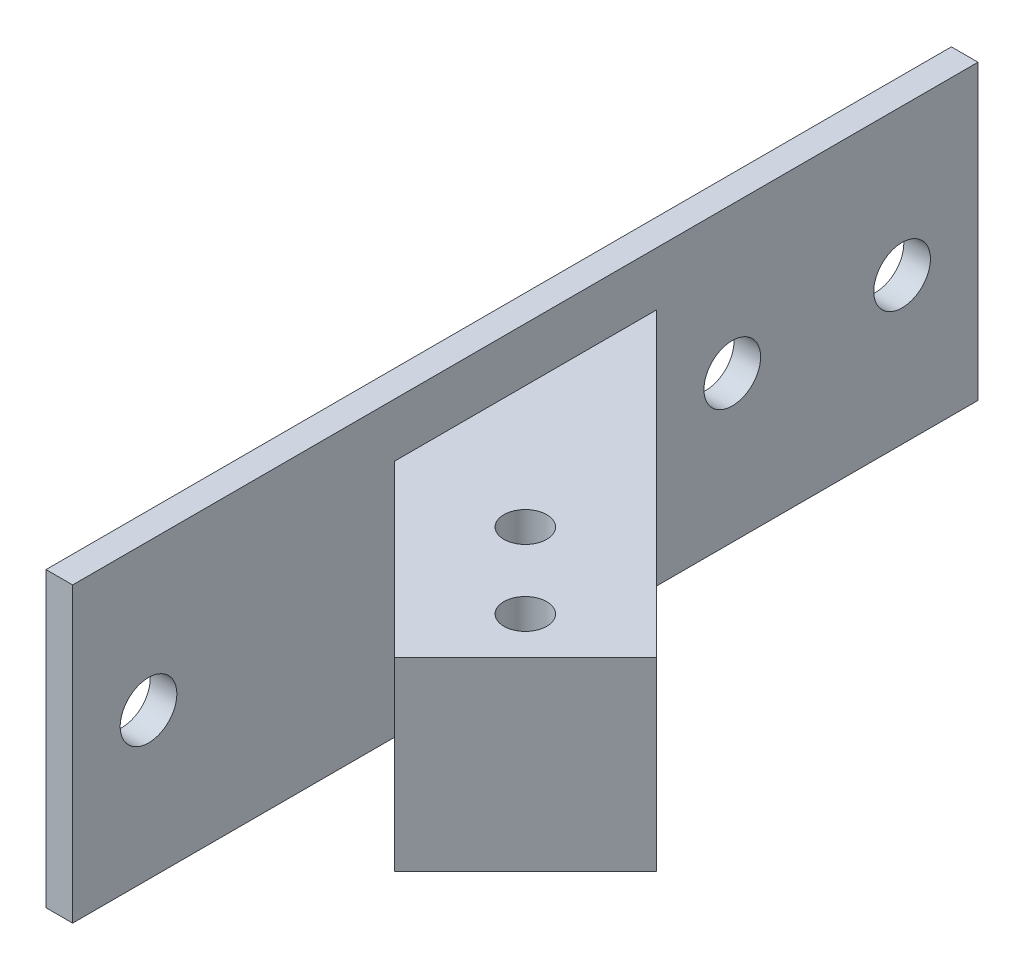
ISO-10303-21;
HEADER;
FILE_DESCRIPTION(('STEP AP214'),'2;1');
FILE_NAME('part.step','',(''),(''),'','','');
FILE_SCHEMA(('AUTOMOTIVE_DESIGN { 1 0 10303 214 1 1 1 1 }'));
ENDSEC;
DATA;
#1=APPLICATION_CONTEXT('core data for automotive mechanical design processes');
#2=APPLICATION_PROTOCOL_DEFINITION('international standard','automotive_design',2000,#1);
#3=PRODUCT_CONTEXT('',#1,'mechanical');
#4=PRODUCT('Part','Part','',(#3));
#5=PRODUCT_RELATED_PRODUCT_CATEGORY('part','',(#4));
#6=PRODUCT_DEFINITION_FORMATION('','',#4);
#7=PRODUCT_DEFINITION_CONTEXT('part definition',#1,'design');
#8=PRODUCT_DEFINITION('design','',#6,#7);
#9=PRODUCT_DEFINITION_SHAPE('','',#8);
#10=(LENGTH_UNIT() NAMED_UNIT(*) SI_UNIT(.MILLI.,.METRE.));
#11=(NAMED_UNIT(*) PLANE_ANGLE_UNIT() SI_UNIT($,.RADIAN.));
#12=(NAMED_UNIT(*) SI_UNIT($,.STERADIAN.) SOLID_ANGLE_UNIT());
#13=UNCERTAINTY_MEASURE_WITH_UNIT(LENGTH_MEASURE(1.E-05),#10,'distance_accuracy_value','');
#14=(GEOMETRIC_REPRESENTATION_CONTEXT(3) GLOBAL_UNCERTAINTY_ASSIGNED_CONTEXT((#13)) GLOBAL_UNIT_ASSIGNED_CONTEXT((#10,
#11,#12)) REPRESENTATION_CONTEXT('',''));
#15=CARTESIAN_POINT('',(0.,0.,0.));
#16=DIRECTION('',(0.,0.,1.));
#17=DIRECTION('',(1.,0.,0.));
#18=AXIS2_PLACEMENT_3D('',#15,#16,#17);
#19=CARTESIAN_POINT('',(3.175,0.,0.));
#20=DIRECTION('',(1.,0.,0.));
#21=DIRECTION('',(0.,0.,-1.));
#22=AXIS2_PLACEMENT_3D('',#19,#20,#21);
#23=PLANE('',#22);
#24=CARTESIAN_POINT('',(3.175,0.,44.9255616018356));
#25=DIRECTION('',(1.,0.,0.));
#26=DIRECTION('',(0.,0.,-1.));
#27=AXIS2_PLACEMENT_3D('',#24,#25,#26);
#28=CIRCLE('',#27,3.3782);
#29=CARTESIAN_POINT('',(3.175,0.,41.5473616018356));
#30=VERTEX_POINT('',#29);
#31=EDGE_CURVE('E144',#30,#30,#28,.T.);
#32=ORIENTED_EDGE('',*,*,#31,.F.);
#33=EDGE_LOOP('',(#32));
#34=FACE_BOUND('',#33,.T.);
#35=CARTESIAN_POINT('',(3.175,0.,-24.6750840488247));
#36=DIRECTION('',(1.,0.,0.));
#37=DIRECTION('',(0.,0.,-1.));
#38=AXIS2_PLACEMENT_3D('',#35,#36,#37);
#39=CIRCLE('',#38,3.3782);
#40=CARTESIAN_POINT('',(3.175,0.,-28.0532840488247));
#41=VERTEX_POINT('',#40);
#42=EDGE_CURVE('E286',#41,#41,#39,.T.);
#43=ORIENTED_EDGE('',*,*,#42,.F.);
#44=EDGE_LOOP('',(#43));
#45=FACE_BOUND('',#44,.T.);
#46=CARTESIAN_POINT('',(3.175,0.,-44.9255616018356));
#47=DIRECTION('',(1.,0.,0.));
#48=DIRECTION('',(0.,0.,-1.));
#49=AXIS2_PLACEMENT_3D('',#46,#47,#48);
#50=CIRCLE('',#49,3.3782);
#51=CARTESIAN_POINT('',(3.175,0.,-48.3037616018356));
#52=VERTEX_POINT('',#51);
#53=EDGE_CURVE('E292',#52,#52,#50,.T.);
#54=ORIENTED_EDGE('',*,*,#53,.F.);
#55=EDGE_LOOP('',(#54));
#56=FACE_BOUND('',#55,.T.);
#57=DIRECTION('',(0.,1.,0.));
#58=VECTOR('',#57,1.);
#59=CARTESIAN_POINT('',(3.175,17.4625,-53.975));
#60=LINE('',#59,#58);
#61=CARTESIAN_POINT('',(3.175,-17.4625,-53.975));
#62=VERTEX_POINT('',#61);
#63=CARTESIAN_POINT('',(3.175,17.4625,-53.975));
#64=VERTEX_POINT('',#63);
#65=EDGE_CURVE('E166',#62,#64,#60,.T.);
#66=ORIENTED_EDGE('',*,*,#65,.T.);
#67=DIRECTION('',(0.,0.,1.));
#68=VECTOR('',#67,1.);
#69=CARTESIAN_POINT('',(3.175,17.4625,53.975));
#70=LINE('',#69,#68);
#71=CARTESIAN_POINT('',(3.175,17.4625,53.975));
#72=VERTEX_POINT('',#71);
#73=EDGE_CURVE('E93',#64,#72,#70,.T.);
#74=ORIENTED_EDGE('',*,*,#73,.T.);
#75=DIRECTION('',(0.,-1.,0.));
#76=VECTOR('',#75,1.);
#77=CARTESIAN_POINT('',(3.175,17.4625,53.975));
#78=LINE('',#77,#76);
#79=CARTESIAN_POINT('',(3.175,-17.4625,53.975));
#80=VERTEX_POINT('',#79);
#81=EDGE_CURVE('E171',#72,#80,#78,.T.);
#82=ORIENTED_EDGE('',*,*,#81,.T.);
#83=DIRECTION('',(0.,0.,-1.));
#84=VECTOR('',#83,1.);
#85=CARTESIAN_POINT('',(3.175,-17.4625,53.975));
#86=LINE('',#85,#84);
#87=EDGE_CURVE('E65',#80,#62,#86,.T.);
#88=ORIENTED_EDGE('',*,*,#87,.T.);
#89=EDGE_LOOP('',(#66,#74,#82,#88));
#90=FACE_BOUND('',#89,.T.);
#91=DIRECTION('',(0.,0.,-1.));
#92=VECTOR('',#91,1.);
#93=CARTESIAN_POINT('',(3.175,11.049,-18.8618228253301));
#94=LINE('',#93,#92);
#95=CARTESIAN_POINT('',(3.175,11.049,15.6256456506603));
#96=VERTEX_POINT('',#95);
#97=CARTESIAN_POINT('',(3.175,11.049,-15.6256456506603));
#98=VERTEX_POINT('',#97);
#99=EDGE_CURVE('E162',#96,#98,#94,.T.);
#100=ORIENTED_EDGE('',*,*,#99,.T.);
#101=DIRECTION('',(0.,-1.,0.));
#102=VECTOR('',#101,1.);
#103=CARTESIAN_POINT('',(3.175,-11.049,-15.6256456506603));
#104=LINE('',#103,#102);
#105=CARTESIAN_POINT('',(3.175,-11.049,-15.6256456506603));
#106=VERTEX_POINT('',#105);
#107=EDGE_CURVE('E121',#98,#106,#104,.T.);
#108=ORIENTED_EDGE('',*,*,#107,.T.);
#109=DIRECTION('',(0.,0.,1.));
#110=VECTOR('',#109,1.);
#111=CARTESIAN_POINT('',(3.175,-11.049,-18.8618228253301));
#112=LINE('',#111,#110);
#113=CARTESIAN_POINT('',(3.175,-11.049,15.6256456506603));
#114=VERTEX_POINT('',#113);
#115=EDGE_CURVE('E304',#106,#114,#112,.T.);
#116=ORIENTED_EDGE('',*,*,#115,.T.);
#117=DIRECTION('',(0.,1.,0.));
#118=VECTOR('',#117,1.);
#119=CARTESIAN_POINT('',(3.175,-11.049,15.6256456506603));
#120=LINE('',#119,#118);
#121=EDGE_CURVE('E156',#114,#96,#120,.T.);
#122=ORIENTED_EDGE('',*,*,#121,.T.);
#123=EDGE_LOOP('',(#100,#108,#116,#122));
#124=FACE_BOUND('',#123,.T.);
#125=ADVANCED_FACE('F40',(#34,#45,#56,#90,#124),#23,.T.);
#126=CARTESIAN_POINT('',(3.175,17.4625,-53.975));
#127=DIRECTION('',(0.,0.,1.));
#128=DIRECTION('',(1.,0.,0.));
#129=AXIS2_PLACEMENT_3D('',#126,#127,#128);
#130=PLANE('',#129);
#131=DIRECTION('',(0.,1.,0.));
#132=VECTOR('',#131,1.);
#133=CARTESIAN_POINT('',(0.,17.4625,-53.975));
#134=LINE('',#133,#132);
#135=CARTESIAN_POINT('',(0.,-17.4625,-53.975));
#136=VERTEX_POINT('',#135);
#137=CARTESIAN_POINT('',(0.,17.4625,-53.975));
#138=VERTEX_POINT('',#137);
#139=EDGE_CURVE('E165',#136,#138,#134,.T.);
#140=ORIENTED_EDGE('',*,*,#139,.T.);
#141=DIRECTION('',(-1.,0.,0.));
#142=VECTOR('',#141,1.);
#143=CARTESIAN_POINT('',(3.175,17.4625,-53.975));
#144=LINE('',#143,#142);
#145=EDGE_CURVE('E11',#64,#138,#144,.T.);
#146=ORIENTED_EDGE('',*,*,#145,.F.);
#147=ORIENTED_EDGE('',*,*,#65,.F.);
#148=DIRECTION('',(-1.,0.,0.));
#149=VECTOR('',#148,1.);
#150=CARTESIAN_POINT('',(3.175,-17.4625,-53.975));
#151=LINE('',#150,#149);
#152=EDGE_CURVE('E176',#62,#136,#151,.T.);
#153=ORIENTED_EDGE('',*,*,#152,.T.);
#154=EDGE_LOOP('',(#140,#146,#147,#153));
#155=FACE_BOUND('',#154,.T.);
#156=ADVANCED_FACE('F42',(#155),#130,.F.);
#157=CARTESIAN_POINT('',(3.175,17.4625,53.975));
#158=DIRECTION('',(0.,-1.,0.));
#159=DIRECTION('',(0.,0.,-1.));
#160=AXIS2_PLACEMENT_3D('',#157,#158,#159);
#161=PLANE('',#160);
#162=DIRECTION('',(0.,0.,1.));
#163=VECTOR('',#162,1.);
#164=CARTESIAN_POINT('',(0.,17.4625,53.975));
#165=LINE('',#164,#163);
#166=CARTESIAN_POINT('',(0.,17.4625,53.975));
#167=VERTEX_POINT('',#166);
#168=EDGE_CURVE('E180',#138,#167,#165,.T.);
#169=ORIENTED_EDGE('',*,*,#168,.T.);
#170=DIRECTION('',(-1.,0.,0.));
#171=VECTOR('',#170,1.);
#172=CARTESIAN_POINT('',(3.175,17.4625,53.975));
#173=LINE('',#172,#171);
#174=EDGE_CURVE('E49',#72,#167,#173,.T.);
#175=ORIENTED_EDGE('',*,*,#174,.F.);
#176=ORIENTED_EDGE('',*,*,#73,.F.);
#177=ORIENTED_EDGE('',*,*,#145,.T.);
#178=EDGE_LOOP('',(#169,#175,#176,#177));
#179=FACE_BOUND('',#178,.T.);
#180=ADVANCED_FACE('F215',(#179),#161,.F.);
#181=CARTESIAN_POINT('',(3.175,17.4625,53.975));
#182=DIRECTION('',(0.,0.,-1.));
#183=DIRECTION('',(0.,1.,0.));
#184=AXIS2_PLACEMENT_3D('',#181,#182,#183);
#185=PLANE('',#184);
#186=DIRECTION('',(0.,-1.,0.));
#187=VECTOR('',#186,1.);
#188=CARTESIAN_POINT('',(0.,17.4625,53.975));
#189=LINE('',#188,#187);
#190=CARTESIAN_POINT('',(0.,-17.4625,53.975));
#191=VERTEX_POINT('',#190);
#192=EDGE_CURVE('E183',#167,#191,#189,.T.);
#193=ORIENTED_EDGE('',*,*,#192,.T.);
#194=DIRECTION('',(-1.,0.,0.));
#195=VECTOR('',#194,1.);
#196=CARTESIAN_POINT('',(3.175,-17.4625,53.975));
#197=LINE('',#196,#195);
#198=EDGE_CURVE('E190',#80,#191,#197,.T.);
#199=ORIENTED_EDGE('',*,*,#198,.F.);
#200=ORIENTED_EDGE('',*,*,#81,.F.);
#201=ORIENTED_EDGE('',*,*,#174,.T.);
#202=EDGE_LOOP('',(#193,#199,#200,#201));
#203=FACE_BOUND('',#202,.T.);
#204=ADVANCED_FACE('F198',(#203),#185,.F.);
#205=CARTESIAN_POINT('',(3.175,-17.4625,53.975));
#206=DIRECTION('',(0.,1.,0.));
#207=DIRECTION('',(0.,0.,1.));
#208=AXIS2_PLACEMENT_3D('',#205,#206,#207);
#209=PLANE('',#208);
#210=DIRECTION('',(0.,0.,-1.));
#211=VECTOR('',#210,1.);
#212=CARTESIAN_POINT('',(0.,-17.4625,53.975));
#213=LINE('',#212,#211);
#214=EDGE_CURVE('E86',#191,#136,#213,.T.);
#215=ORIENTED_EDGE('',*,*,#214,.T.);
#216=ORIENTED_EDGE('',*,*,#152,.F.);
#217=ORIENTED_EDGE('',*,*,#87,.F.);
#218=ORIENTED_EDGE('',*,*,#198,.T.);
#219=EDGE_LOOP('',(#215,#216,#217,#218));
#220=FACE_BOUND('',#219,.T.);
#221=ADVANCED_FACE('F206',(#220),#209,.F.);
#222=CARTESIAN_POINT('',(0.,0.,0.));
#223=DIRECTION('',(1.,0.,0.));
#224=DIRECTION('',(0.,0.,-1.));
#225=AXIS2_PLACEMENT_3D('',#222,#223,#224);
#226=PLANE('',#225);
#227=CARTESIAN_POINT('',(0.,0.,44.9255616018356));
#228=DIRECTION('',(1.,0.,0.));
#229=DIRECTION('',(0.,0.,-1.));
#230=AXIS2_PLACEMENT_3D('',#227,#228,#229);
#231=CIRCLE('',#230,3.3782);
#232=CARTESIAN_POINT('',(0.,0.,41.5473616018356));
#233=VERTEX_POINT('',#232);
#234=EDGE_CURVE('E139',#233,#233,#231,.F.);
#235=ORIENTED_EDGE('',*,*,#234,.F.);
#236=EDGE_LOOP('',(#235));
#237=FACE_BOUND('',#236,.T.);
#238=CARTESIAN_POINT('',(0.,0.,-24.6750840488247));
#239=DIRECTION('',(1.,0.,0.));
#240=DIRECTION('',(0.,0.,-1.));
#241=AXIS2_PLACEMENT_3D('',#238,#239,#240);
#242=CIRCLE('',#241,3.3782);
#243=CARTESIAN_POINT('',(0.,0.,-28.0532840488247));
#244=VERTEX_POINT('',#243);
#245=EDGE_CURVE('E288',#244,#244,#242,.F.);
#246=ORIENTED_EDGE('',*,*,#245,.F.);
#247=EDGE_LOOP('',(#246));
#248=FACE_BOUND('',#247,.T.);
#249=CARTESIAN_POINT('',(0.,0.,-44.9255616018356));
#250=DIRECTION('',(1.,0.,0.));
#251=DIRECTION('',(0.,0.,-1.));
#252=AXIS2_PLACEMENT_3D('',#249,#250,#251);
#253=CIRCLE('',#252,3.3782);
#254=CARTESIAN_POINT('',(0.,0.,-48.3037616018356));
#255=VERTEX_POINT('',#254);
#256=EDGE_CURVE('E283',#255,#255,#253,.F.);
#257=ORIENTED_EDGE('',*,*,#256,.F.);
#258=EDGE_LOOP('',(#257));
#259=FACE_BOUND('',#258,.T.);
#260=ORIENTED_EDGE('',*,*,#139,.F.);
#261=ORIENTED_EDGE('',*,*,#214,.F.);
#262=ORIENTED_EDGE('',*,*,#192,.F.);
#263=ORIENTED_EDGE('',*,*,#168,.F.);
#264=EDGE_LOOP('',(#260,#261,#262,#263));
#265=FACE_BOUND('',#264,.T.);
#266=ADVANCED_FACE('F202',(#237,#248,#259,#265),#226,.F.);
#267=CARTESIAN_POINT('',(-15.6868228253302,-11.049,-34.4874684759904));
#268=DIRECTION('',(0.707106781186546,0.,-0.707106781186549));
#269=DIRECTION('',(-0.707106781186549,0.,-0.707106781186546));
#270=AXIS2_PLACEMENT_3D('',#267,#268,#269);
#271=PLANE('',#270);
#272=ORIENTED_EDGE('',*,*,#107,.F.);
#273=DIRECTION('',(0.707106781186549,0.,0.707106781186546));
#274=VECTOR('',#273,1.);
#275=CARTESIAN_POINT('',(-15.6868228253302,11.049,-34.4874684759904));
#276=LINE('',#275,#274);
#277=CARTESIAN_POINT('',(39.0511232036713,11.049,20.2504775530108));
#278=VERTEX_POINT('',#277);
#279=EDGE_CURVE('E56',#98,#278,#276,.T.);
#280=ORIENTED_EDGE('',*,*,#279,.T.);
#281=DIRECTION('',(0.,1.,0.));
#282=VECTOR('',#281,1.);
#283=CARTESIAN_POINT('',(39.0511232036713,-11.049,20.2504775530108));
#284=LINE('',#283,#282);
#285=CARTESIAN_POINT('',(39.0511232036713,-11.049,20.2504775530108));
#286=VERTEX_POINT('',#285);
#287=EDGE_CURVE('E118',#286,#278,#284,.T.);
#288=ORIENTED_EDGE('',*,*,#287,.F.);
#289=DIRECTION('',(0.707106781186549,0.,0.707106781186546));
#290=VECTOR('',#289,1.);
#291=CARTESIAN_POINT('',(-15.6868228253302,-11.049,-34.4874684759904));
#292=LINE('',#291,#290);
#293=EDGE_CURVE('E153',#106,#286,#292,.T.);
#294=ORIENTED_EDGE('',*,*,#293,.F.);
#295=EDGE_LOOP('',(#272,#280,#288,#294));
#296=FACE_BOUND('',#295,.T.);
#297=ADVANCED_FACE('F115',(#296),#271,.T.);
#298=CARTESIAN_POINT('',(-31.3124684759905,-11.049,-18.8618228253301));
#299=DIRECTION('',(0.,-1.,0.));
#300=DIRECTION('',(0.,0.,-1.));
#301=AXIS2_PLACEMENT_3D('',#298,#299,#300);
#302=PLANE('',#301);
#303=CARTESIAN_POINT('',(17.7679161967374,-11.049,14.5929161967373));
#304=DIRECTION('',(0.,-1.,0.));
#305=DIRECTION('',(0.,0.,-1.));
#306=AXIS2_PLACEMENT_3D('',#303,#304,#305);
#307=CIRCLE('',#306,2.55269999999999);
#308=CARTESIAN_POINT('',(17.7679161967374,-11.049,12.0402161967373));
#309=VERTEX_POINT('',#308);
#310=EDGE_CURVE('E265',#309,#309,#307,.T.);
#311=ORIENTED_EDGE('',*,*,#310,.F.);
#312=EDGE_LOOP('',(#311));
#313=FACE_BOUND('',#312,.T.);
#314=CARTESIAN_POINT('',(26.7481723178066,-11.049,23.5731723178064));
#315=DIRECTION('',(0.,-1.,0.));
#316=DIRECTION('',(0.,0.,-1.));
#317=AXIS2_PLACEMENT_3D('',#314,#315,#316);
#318=CIRCLE('',#317,2.55269999999999);
#319=CARTESIAN_POINT('',(26.7481723178066,-11.049,21.0204723178065));
#320=VERTEX_POINT('',#319);
#321=EDGE_CURVE('E279',#320,#320,#318,.T.);
#322=ORIENTED_EDGE('',*,*,#321,.F.);
#323=EDGE_LOOP('',(#322));
#324=FACE_BOUND('',#323,.T.);
#325=ORIENTED_EDGE('',*,*,#115,.F.);
#326=ORIENTED_EDGE('',*,*,#293,.T.);
#327=DIRECTION('',(0.707106781186546,0.,-0.707106781186549));
#328=VECTOR('',#327,1.);
#329=CARTESIAN_POINT('',(23.425477553011,-11.049,35.8761232036712));
#330=LINE('',#329,#328);
#331=CARTESIAN_POINT('',(23.425477553011,-11.049,35.8761232036712));
#332=VERTEX_POINT('',#331);
#333=EDGE_CURVE('E125',#332,#286,#330,.T.);
#334=ORIENTED_EDGE('',*,*,#333,.F.);
#335=DIRECTION('',(0.707106781186549,0.,0.707106781186546));
#336=VECTOR('',#335,1.);
#337=CARTESIAN_POINT('',(-31.3124684759905,-11.049,-18.8618228253301));
#338=LINE('',#337,#336);
#339=EDGE_CURVE('E157',#114,#332,#338,.T.);
#340=ORIENTED_EDGE('',*,*,#339,.F.);
#341=EDGE_LOOP('',(#325,#326,#334,#340));
#342=FACE_BOUND('',#341,.T.);
#343=ADVANCED_FACE('F228',(#313,#324,#342),#302,.T.);
#344=CARTESIAN_POINT('',(-31.3124684759905,-11.049,-18.8618228253301));
#345=DIRECTION('',(-0.707106781186546,0.,0.707106781186549));
#346=DIRECTION('',(0.707106781186549,0.,0.707106781186546));
#347=AXIS2_PLACEMENT_3D('',#344,#345,#346);
#348=PLANE('',#347);
#349=ORIENTED_EDGE('',*,*,#121,.F.);
#350=ORIENTED_EDGE('',*,*,#339,.T.);
#351=DIRECTION('',(0.,-1.,0.));
#352=VECTOR('',#351,1.);
#353=CARTESIAN_POINT('',(23.425477553011,-11.049,35.8761232036712));
#354=LINE('',#353,#352);
#355=CARTESIAN_POINT('',(23.425477553011,11.049,35.8761232036712));
#356=VERTEX_POINT('',#355);
#357=EDGE_CURVE('E134',#356,#332,#354,.T.);
#358=ORIENTED_EDGE('',*,*,#357,.F.);
#359=DIRECTION('',(0.707106781186549,0.,0.707106781186546));
#360=VECTOR('',#359,1.);
#361=CARTESIAN_POINT('',(-31.3124684759905,11.049,-18.8618228253301));
#362=LINE('',#361,#360);
#363=EDGE_CURVE('E124',#96,#356,#362,.T.);
#364=ORIENTED_EDGE('',*,*,#363,.F.);
#365=EDGE_LOOP('',(#349,#350,#358,#364));
#366=FACE_BOUND('',#365,.T.);
#367=ADVANCED_FACE('F231',(#366),#348,.T.);
#368=CARTESIAN_POINT('',(-31.3124684759905,11.049,-18.8618228253301));
#369=DIRECTION('',(0.,1.,0.));
#370=DIRECTION('',(0.,0.,1.));
#371=AXIS2_PLACEMENT_3D('',#368,#369,#370);
#372=PLANE('',#371);
#373=CARTESIAN_POINT('',(17.7679161967374,11.049,14.5929161967373));
#374=DIRECTION('',(0.,1.,0.));
#375=DIRECTION('',(0.,0.,1.));
#376=AXIS2_PLACEMENT_3D('',#373,#374,#375);
#377=CIRCLE('',#376,2.55269999999999);
#378=CARTESIAN_POINT('',(17.7679161967374,11.049,17.1456161967373));
#379=VERTEX_POINT('',#378);
#380=EDGE_CURVE('E268',#379,#379,#377,.T.);
#381=ORIENTED_EDGE('',*,*,#380,.F.);
#382=EDGE_LOOP('',(#381));
#383=FACE_BOUND('',#382,.T.);
#384=CARTESIAN_POINT('',(26.7481723178066,11.049,23.5731723178064));
#385=DIRECTION('',(0.,1.,0.));
#386=DIRECTION('',(0.,0.,1.));
#387=AXIS2_PLACEMENT_3D('',#384,#385,#386);
#388=CIRCLE('',#387,2.55269999999999);
#389=CARTESIAN_POINT('',(26.7481723178066,11.049,26.1258723178064));
#390=VERTEX_POINT('',#389);
#391=EDGE_CURVE('E273',#390,#390,#388,.T.);
#392=ORIENTED_EDGE('',*,*,#391,.F.);
#393=EDGE_LOOP('',(#392));
#394=FACE_BOUND('',#393,.T.);
#395=ORIENTED_EDGE('',*,*,#99,.F.);
#396=ORIENTED_EDGE('',*,*,#363,.T.);
#397=DIRECTION('',(-0.707106781186546,0.,0.707106781186549));
#398=VECTOR('',#397,1.);
#399=CARTESIAN_POINT('',(23.425477553011,11.049,35.8761232036712));
#400=LINE('',#399,#398);
#401=EDGE_CURVE('E128',#278,#356,#400,.T.);
#402=ORIENTED_EDGE('',*,*,#401,.F.);
#403=ORIENTED_EDGE('',*,*,#279,.F.);
#404=EDGE_LOOP('',(#395,#396,#402,#403));
#405=FACE_BOUND('',#404,.T.);
#406=ADVANCED_FACE('F129',(#383,#394,#405),#372,.T.);
#407=CARTESIAN_POINT('',(29.6508003783411,0.,29.650800378341));
#408=DIRECTION('',(-0.707106781186549,0.,-0.707106781186546));
#409=DIRECTION('',(-0.707106781186546,0.,0.707106781186549));
#410=AXIS2_PLACEMENT_3D('',#407,#408,#409);
#411=PLANE('',#410);
#412=ORIENTED_EDGE('',*,*,#287,.T.);
#413=ORIENTED_EDGE('',*,*,#401,.T.);
#414=ORIENTED_EDGE('',*,*,#357,.T.);
#415=ORIENTED_EDGE('',*,*,#333,.T.);
#416=EDGE_LOOP('',(#412,#413,#414,#415));
#417=FACE_BOUND('',#416,.T.);
#418=ADVANCED_FACE('F136',(#417),#411,.F.);
#419=CARTESIAN_POINT('',(-0.00100000000000013,0.,-44.9255616018356));
#420=DIRECTION('',(1.,0.,0.));
#421=DIRECTION('',(0.,0.,-1.));
#422=AXIS2_PLACEMENT_3D('',#419,#420,#421);
#423=CYLINDRICAL_SURFACE('',#422,3.3782);
#424=ORIENTED_EDGE('',*,*,#53,.T.);
#425=EDGE_LOOP('',(#424));
#426=FACE_BOUND('',#425,.T.);
#427=ORIENTED_EDGE('',*,*,#256,.T.);
#428=EDGE_LOOP('',(#427));
#429=FACE_BOUND('',#428,.T.);
#430=ADVANCED_FACE('F241',(#426,#429),#423,.F.);
#431=CARTESIAN_POINT('',(-0.00100000000000013,0.,-24.6750840488247));
#432=DIRECTION('',(1.,0.,0.));
#433=DIRECTION('',(0.,0.,-1.));
#434=AXIS2_PLACEMENT_3D('',#431,#432,#433);
#435=CYLINDRICAL_SURFACE('',#434,3.3782);
#436=ORIENTED_EDGE('',*,*,#42,.T.);
#437=EDGE_LOOP('',(#436));
#438=FACE_BOUND('',#437,.T.);
#439=ORIENTED_EDGE('',*,*,#245,.T.);
#440=EDGE_LOOP('',(#439));
#441=FACE_BOUND('',#440,.T.);
#442=ADVANCED_FACE('F244',(#438,#441),#435,.F.);
#443=CARTESIAN_POINT('',(-0.00100000000000013,0.,44.9255616018356));
#444=DIRECTION('',(1.,0.,0.));
#445=DIRECTION('',(0.,0.,-1.));
#446=AXIS2_PLACEMENT_3D('',#443,#444,#445);
#447=CYLINDRICAL_SURFACE('',#446,3.3782);
#448=ORIENTED_EDGE('',*,*,#31,.T.);
#449=EDGE_LOOP('',(#448));
#450=FACE_BOUND('',#449,.T.);
#451=ORIENTED_EDGE('',*,*,#234,.T.);
#452=EDGE_LOOP('',(#451));
#453=FACE_BOUND('',#452,.T.);
#454=ADVANCED_FACE('F248',(#450,#453),#447,.F.);
#455=CARTESIAN_POINT('',(26.7481723178066,11.049,23.5731723178064));
#456=DIRECTION('',(0.,1.,0.));
#457=DIRECTION('',(0.,0.,1.));
#458=AXIS2_PLACEMENT_3D('',#455,#456,#457);
#459=CYLINDRICAL_SURFACE('',#458,2.55269999999999);
#460=ORIENTED_EDGE('',*,*,#321,.T.);
#461=EDGE_LOOP('',(#460));
#462=FACE_BOUND('',#461,.T.);
#463=ORIENTED_EDGE('',*,*,#391,.T.);
#464=EDGE_LOOP('',(#463));
#465=FACE_BOUND('',#464,.T.);
#466=ADVANCED_FACE('F252',(#462,#465),#459,.F.);
#467=CARTESIAN_POINT('',(17.7679161967374,11.049,14.5929161967373));
#468=DIRECTION('',(0.,1.,0.));
#469=DIRECTION('',(0.,0.,1.));
#470=AXIS2_PLACEMENT_3D('',#467,#468,#469);
#471=CYLINDRICAL_SURFACE('',#470,2.55269999999999);
#472=ORIENTED_EDGE('',*,*,#310,.T.);
#473=EDGE_LOOP('',(#472));
#474=FACE_BOUND('',#473,.T.);
#475=ORIENTED_EDGE('',*,*,#380,.T.);
#476=EDGE_LOOP('',(#475));
#477=FACE_BOUND('',#476,.T.);
#478=ADVANCED_FACE('F256',(#474,#477),#471,.F.);
#479=CLOSED_SHELL('',(#125,#156,#180,#204,#221,#266,#297,#343,#367,#406,#418,#430,#442,#454,
#466,#478));
#480=MANIFOLD_SOLID_BREP('B2',#479);
#481=ADVANCED_BREP_SHAPE_REPRESENTATION('',(#18,#480),#14);
#482=SHAPE_DEFINITION_REPRESENTATION(#9,#481);
ENDSEC;
END-ISO-10303-21;
